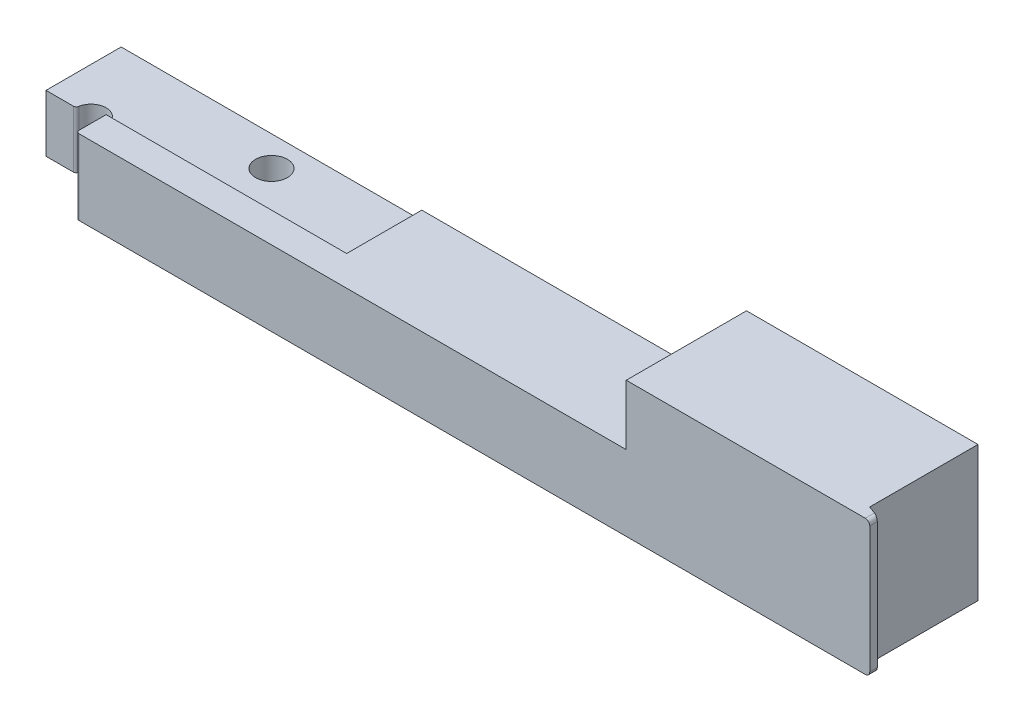
ISO-10303-21;
HEADER;
FILE_DESCRIPTION(('STEP AP214'),'2;1');
FILE_NAME('part.step','',(''),(''),'','','');
FILE_SCHEMA(('AUTOMOTIVE_DESIGN { 1 0 10303 214 1 1 1 1 }'));
ENDSEC;
DATA;
#1=APPLICATION_CONTEXT('core data for automotive mechanical design processes');
#2=APPLICATION_PROTOCOL_DEFINITION('international standard','automotive_design',2000,#1);
#3=PRODUCT_CONTEXT('',#1,'mechanical');
#4=PRODUCT('Part','Part','',(#3));
#5=PRODUCT_RELATED_PRODUCT_CATEGORY('part','',(#4));
#6=PRODUCT_DEFINITION_FORMATION('','',#4);
#7=PRODUCT_DEFINITION_CONTEXT('part definition',#1,'design');
#8=PRODUCT_DEFINITION('design','',#6,#7);
#9=PRODUCT_DEFINITION_SHAPE('','',#8);
#10=(LENGTH_UNIT() NAMED_UNIT(*) SI_UNIT(.MILLI.,.METRE.));
#11=(NAMED_UNIT(*) PLANE_ANGLE_UNIT() SI_UNIT($,.RADIAN.));
#12=(NAMED_UNIT(*) SI_UNIT($,.STERADIAN.) SOLID_ANGLE_UNIT());
#13=UNCERTAINTY_MEASURE_WITH_UNIT(LENGTH_MEASURE(1.E-05),#10,'distance_accuracy_value','');
#14=(GEOMETRIC_REPRESENTATION_CONTEXT(3) GLOBAL_UNCERTAINTY_ASSIGNED_CONTEXT((#13)) GLOBAL_UNIT_ASSIGNED_CONTEXT((#10,
#11,#12)) REPRESENTATION_CONTEXT('',''));
#15=CARTESIAN_POINT('',(0.,0.,0.));
#16=DIRECTION('',(0.,0.,1.));
#17=DIRECTION('',(1.,0.,0.));
#18=AXIS2_PLACEMENT_3D('',#15,#16,#17);
#19=CARTESIAN_POINT('',(0.,0.,-20.));
#20=DIRECTION('',(0.,-1.,0.));
#21=DIRECTION('',(1.,0.,0.));
#22=AXIS2_PLACEMENT_3D('',#19,#20,#21);
#23=PLANE('',#22);
#24=DIRECTION('',(0.,0.,-1.));
#25=VECTOR('',#24,1.);
#26=CARTESIAN_POINT('',(10.,0.,0.));
#27=LINE('',#26,#25);
#28=CARTESIAN_POINT('',(10.,0.,-0.5));
#29=VERTEX_POINT('',#28);
#30=CARTESIAN_POINT('',(10.,0.,-5.));
#31=VERTEX_POINT('',#30);
#32=EDGE_CURVE('E213',#29,#31,#27,.T.);
#33=ORIENTED_EDGE('',*,*,#32,.T.);
#34=DIRECTION('',(1.,0.,0.));
#35=VECTOR('',#34,1.);
#36=CARTESIAN_POINT('',(0.,0.,-5.));
#37=LINE('',#36,#35);
#38=CARTESIAN_POINT('',(50.,0.,-5.));
#39=VERTEX_POINT('',#38);
#40=EDGE_CURVE('E498',#31,#39,#37,.T.);
#41=ORIENTED_EDGE('',*,*,#40,.T.);
#42=DIRECTION('',(0.,0.,1.));
#43=VECTOR('',#42,1.);
#44=CARTESIAN_POINT('',(50.,0.,-17.5));
#45=LINE('',#44,#43);
#46=CARTESIAN_POINT('',(50.,0.,-17.5));
#47=VERTEX_POINT('',#46);
#48=EDGE_CURVE('E447',#47,#39,#45,.T.);
#49=ORIENTED_EDGE('',*,*,#48,.F.);
#50=DIRECTION('',(1.,0.,0.));
#51=VECTOR('',#50,1.);
#52=CARTESIAN_POINT('',(100.,0.,-17.5));
#53=LINE('',#52,#51);
#54=CARTESIAN_POINT('',(100.,0.,-17.5));
#55=VERTEX_POINT('',#54);
#56=EDGE_CURVE('E232',#47,#55,#53,.T.);
#57=ORIENTED_EDGE('',*,*,#56,.T.);
#58=DIRECTION('',(0.514495755427527,0.,-0.857492925712544));
#59=VECTOR('',#58,1.);
#60=CARTESIAN_POINT('',(100.,0.,-17.5));
#61=LINE('',#60,#59);
#62=CARTESIAN_POINT('',(101.5,0.,-20.));
#63=VERTEX_POINT('',#62);
#64=EDGE_CURVE('E236',#55,#63,#61,.T.);
#65=ORIENTED_EDGE('',*,*,#64,.T.);
#66=DIRECTION('',(1.,0.,0.));
#67=VECTOR('',#66,1.);
#68=CARTESIAN_POINT('',(0.,0.,-20.));
#69=LINE('',#68,#67);
#70=CARTESIAN_POINT('',(140.,0.,-20.));
#71=VERTEX_POINT('',#70);
#72=EDGE_CURVE('E257',#63,#71,#69,.T.);
#73=ORIENTED_EDGE('',*,*,#72,.T.);
#74=DIRECTION('',(0.,0.,1.));
#75=VECTOR('',#74,1.);
#76=CARTESIAN_POINT('',(140.,0.,-20.));
#77=LINE('',#76,#75);
#78=CARTESIAN_POINT('',(140.,0.,-1.97794046853239));
#79=VERTEX_POINT('',#78);
#80=EDGE_CURVE('E241',#71,#79,#77,.T.);
#81=ORIENTED_EDGE('',*,*,#80,.T.);
#82=DIRECTION('',(-0.939692620785909,0.,-0.342020143325667));
#83=VECTOR('',#82,1.);
#84=CARTESIAN_POINT('',(10.5847106977411,0.,-49.0812536335036));
#85=LINE('',#84,#83);
#86=CARTESIAN_POINT('',(141.25,0.,-1.52297767569964));
#87=VERTEX_POINT('',#86);
#88=EDGE_CURVE('E270',#79,#87,#85,.F.);
#89=ORIENTED_EDGE('',*,*,#88,.T.);
#90=DIRECTION('',(0.,0.,1.));
#91=VECTOR('',#90,1.);
#92=CARTESIAN_POINT('',(141.25,0.,-20.));
#93=LINE('',#92,#91);
#94=CARTESIAN_POINT('',(141.25,0.,0.));
#95=VERTEX_POINT('',#94);
#96=EDGE_CURVE('E276',#87,#95,#93,.T.);
#97=ORIENTED_EDGE('',*,*,#96,.T.);
#98=DIRECTION('',(1.,0.,0.));
#99=VECTOR('',#98,1.);
#100=CARTESIAN_POINT('',(0.,0.,0.));
#101=LINE('',#100,#99);
#102=CARTESIAN_POINT('',(10.5,0.,0.));
#103=VERTEX_POINT('',#102);
#104=EDGE_CURVE('E258',#103,#95,#101,.T.);
#105=ORIENTED_EDGE('',*,*,#104,.F.);
#106=CARTESIAN_POINT('',(10.5,0.,-0.5));
#107=DIRECTION('',(0.,-1.,0.));
#108=DIRECTION('',(1.,0.,0.));
#109=AXIS2_PLACEMENT_3D('',#106,#107,#108);
#110=CIRCLE('',#109,0.5);
#111=EDGE_CURVE('E309',#103,#29,#110,.T.);
#112=ORIENTED_EDGE('',*,*,#111,.T.);
#113=EDGE_LOOP('',(#33,#41,#49,#57,#65,#73,#81,#89,#97,#105,#112));
#114=FACE_BOUND('',#113,.T.);
#115=ADVANCED_FACE('F44',(#114),#23,.T.);
#116=CARTESIAN_POINT('',(100.,0.,-17.5));
#117=DIRECTION('',(0.,0.,1.));
#118=DIRECTION('',(1.,0.,0.));
#119=AXIS2_PLACEMENT_3D('',#116,#117,#118);
#120=PLANE('',#119);
#121=ORIENTED_EDGE('',*,*,#56,.F.);
#122=DIRECTION('',(0.,-1.,0.));
#123=VECTOR('',#122,1.);
#124=CARTESIAN_POINT('',(50.,1.50000000000001,-17.5));
#125=LINE('',#124,#123);
#126=CARTESIAN_POINT('',(50.,1.50000000000001,-17.5));
#127=VERTEX_POINT('',#126);
#128=EDGE_CURVE('E493',#127,#47,#125,.T.);
#129=ORIENTED_EDGE('',*,*,#128,.F.);
#130=DIRECTION('',(1.,0.,0.));
#131=VECTOR('',#130,1.);
#132=CARTESIAN_POINT('',(0.,1.5,-17.5));
#133=LINE('',#132,#131);
#134=CARTESIAN_POINT('',(0.,1.5,-17.5));
#135=VERTEX_POINT('',#134);
#136=EDGE_CURVE('E207',#135,#127,#133,.T.);
#137=ORIENTED_EDGE('',*,*,#136,.F.);
#138=DIRECTION('',(0.,1.,0.));
#139=VECTOR('',#138,1.);
#140=CARTESIAN_POINT('',(0.,0.,-17.5));
#141=LINE('',#140,#139);
#142=CARTESIAN_POINT('',(0.,11.,-17.5));
#143=VERTEX_POINT('',#142);
#144=EDGE_CURVE('E206',#135,#143,#141,.T.);
#145=ORIENTED_EDGE('',*,*,#144,.T.);
#146=DIRECTION('',(1.,0.,0.));
#147=VECTOR('',#146,1.);
#148=CARTESIAN_POINT('',(0.,11.,-17.5));
#149=LINE('',#148,#147);
#150=CARTESIAN_POINT('',(50.,11.,-17.5));
#151=VERTEX_POINT('',#150);
#152=EDGE_CURVE('E484',#143,#151,#149,.T.);
#153=ORIENTED_EDGE('',*,*,#152,.T.);
#154=DIRECTION('',(0.,1.,0.));
#155=VECTOR('',#154,1.);
#156=CARTESIAN_POINT('',(50.,11.,-17.5));
#157=LINE('',#156,#155);
#158=CARTESIAN_POINT('',(50.,12.5,-17.5));
#159=VERTEX_POINT('',#158);
#160=EDGE_CURVE('E452',#151,#159,#157,.T.);
#161=ORIENTED_EDGE('',*,*,#160,.T.);
#162=DIRECTION('',(1.,0.,0.));
#163=VECTOR('',#162,1.);
#164=CARTESIAN_POINT('',(100.,12.5,-17.5));
#165=LINE('',#164,#163);
#166=CARTESIAN_POINT('',(100.,12.5,-17.5));
#167=VERTEX_POINT('',#166);
#168=EDGE_CURVE('E219',#159,#167,#165,.T.);
#169=ORIENTED_EDGE('',*,*,#168,.T.);
#170=DIRECTION('',(0.,1.,0.));
#171=VECTOR('',#170,1.);
#172=CARTESIAN_POINT('',(100.,0.,-17.5));
#173=LINE('',#172,#171);
#174=EDGE_CURVE('E239',#55,#167,#173,.T.);
#175=ORIENTED_EDGE('',*,*,#174,.F.);
#176=EDGE_LOOP('',(#121,#129,#137,#145,#153,#161,#169,#175));
#177=FACE_BOUND('',#176,.T.);
#178=ADVANCED_FACE('F349',(#177),#120,.F.);
#179=CARTESIAN_POINT('',(0.,22.5,-20.));
#180=DIRECTION('',(0.,-1.,0.));
#181=DIRECTION('',(1.,0.,0.));
#182=AXIS2_PLACEMENT_3D('',#179,#180,#181);
#183=PLANE('',#182);
#184=DIRECTION('',(0.,0.,1.));
#185=VECTOR('',#184,1.);
#186=CARTESIAN_POINT('',(101.5,22.5,-20.));
#187=LINE('',#186,#185);
#188=CARTESIAN_POINT('',(101.5,22.5,-20.));
#189=VERTEX_POINT('',#188);
#190=CARTESIAN_POINT('',(101.5,22.5,0.));
#191=VERTEX_POINT('',#190);
#192=EDGE_CURVE('E467',#189,#191,#187,.T.);
#193=ORIENTED_EDGE('',*,*,#192,.T.);
#194=DIRECTION('',(1.,0.,0.));
#195=VECTOR('',#194,1.);
#196=CARTESIAN_POINT('',(0.,22.5,0.));
#197=LINE('',#196,#195);
#198=CARTESIAN_POINT('',(141.25,22.5,0.));
#199=VERTEX_POINT('',#198);
#200=EDGE_CURVE('E254',#191,#199,#197,.T.);
#201=ORIENTED_EDGE('',*,*,#200,.T.);
#202=DIRECTION('',(0.,0.,1.));
#203=VECTOR('',#202,1.);
#204=CARTESIAN_POINT('',(141.25,22.5,-1.24999999999999));
#205=LINE('',#204,#203);
#206=CARTESIAN_POINT('',(141.25,22.5,-1.52297767569964));
#207=VERTEX_POINT('',#206);
#208=EDGE_CURVE('E293',#199,#207,#205,.F.);
#209=ORIENTED_EDGE('',*,*,#208,.T.);
#210=DIRECTION('',(0.939692620785909,0.,0.342020143325667));
#211=VECTOR('',#210,1.);
#212=CARTESIAN_POINT('',(142.,22.5,-1.24999999999999));
#213=LINE('',#212,#211);
#214=CARTESIAN_POINT('',(140.,22.5,-1.97794046853239));
#215=VERTEX_POINT('',#214);
#216=EDGE_CURVE('E268',#207,#215,#213,.F.);
#217=ORIENTED_EDGE('',*,*,#216,.T.);
#218=DIRECTION('',(0.,0.,1.));
#219=VECTOR('',#218,1.);
#220=CARTESIAN_POINT('',(140.,22.5,-20.));
#221=LINE('',#220,#219);
#222=CARTESIAN_POINT('',(140.,22.5,-20.));
#223=VERTEX_POINT('',#222);
#224=EDGE_CURVE('E248',#223,#215,#221,.T.);
#225=ORIENTED_EDGE('',*,*,#224,.F.);
#226=DIRECTION('',(1.,0.,0.));
#227=VECTOR('',#226,1.);
#228=CARTESIAN_POINT('',(0.,22.5,-20.));
#229=LINE('',#228,#227);
#230=EDGE_CURVE('E255',#189,#223,#229,.T.);
#231=ORIENTED_EDGE('',*,*,#230,.F.);
#232=EDGE_LOOP('',(#193,#201,#209,#217,#225,#231));
#233=FACE_BOUND('',#232,.T.);
#234=ADVANCED_FACE('F356',(#233),#183,.F.);
#235=CARTESIAN_POINT('',(0.,0.,0.));
#236=DIRECTION('',(0.,0.,-1.));
#237=DIRECTION('',(-1.,0.,0.));
#238=AXIS2_PLACEMENT_3D('',#235,#236,#237);
#239=PLANE('',#238);
#240=DIRECTION('',(0.,1.,0.));
#241=VECTOR('',#240,1.);
#242=CARTESIAN_POINT('',(101.5,0.,0.));
#243=LINE('',#242,#241);
#244=CARTESIAN_POINT('',(101.5,12.5,0.));
#245=VERTEX_POINT('',#244);
#246=EDGE_CURVE('E214',#245,#191,#243,.T.);
#247=ORIENTED_EDGE('',*,*,#246,.F.);
#248=DIRECTION('',(-1.,0.,0.));
#249=VECTOR('',#248,1.);
#250=CARTESIAN_POINT('',(0.,12.5,0.));
#251=LINE('',#250,#249);
#252=CARTESIAN_POINT('',(10.5,12.5,0.));
#253=VERTEX_POINT('',#252);
#254=EDGE_CURVE('E459',#245,#253,#251,.T.);
#255=ORIENTED_EDGE('',*,*,#254,.T.);
#256=DIRECTION('',(0.,1.,0.));
#257=VECTOR('',#256,1.);
#258=CARTESIAN_POINT('',(10.5,0.,0.));
#259=LINE('',#258,#257);
#260=EDGE_CURVE('E314',#253,#103,#259,.F.);
#261=ORIENTED_EDGE('',*,*,#260,.T.);
#262=ORIENTED_EDGE('',*,*,#104,.T.);
#263=CARTESIAN_POINT('',(141.25,0.750000000000017,0.));
#264=DIRECTION('',(0.,0.,-1.));
#265=DIRECTION('',(-1.,0.,0.));
#266=AXIS2_PLACEMENT_3D('',#263,#264,#265);
#267=CIRCLE('',#266,0.75);
#268=CARTESIAN_POINT('',(142.,0.750000000000017,0.));
#269=VERTEX_POINT('',#268);
#270=EDGE_CURVE('E282',#95,#269,#267,.F.);
#271=ORIENTED_EDGE('',*,*,#270,.T.);
#272=DIRECTION('',(0.,1.,0.));
#273=VECTOR('',#272,1.);
#274=CARTESIAN_POINT('',(142.,0.,0.));
#275=LINE('',#274,#273);
#276=CARTESIAN_POINT('',(142.,21.75,0.));
#277=VERTEX_POINT('',#276);
#278=EDGE_CURVE('E262',#269,#277,#275,.T.);
#279=ORIENTED_EDGE('',*,*,#278,.T.);
#280=CARTESIAN_POINT('',(141.25,21.75,0.));
#281=DIRECTION('',(0.,0.,-1.));
#282=DIRECTION('',(-1.,0.,0.));
#283=AXIS2_PLACEMENT_3D('',#280,#281,#282);
#284=CIRCLE('',#283,0.75);
#285=EDGE_CURVE('E279',#277,#199,#284,.F.);
#286=ORIENTED_EDGE('',*,*,#285,.T.);
#287=ORIENTED_EDGE('',*,*,#200,.F.);
#288=EDGE_LOOP('',(#247,#255,#261,#262,#271,#279,#286,#287));
#289=FACE_BOUND('',#288,.T.);
#290=ADVANCED_FACE('F361',(#289),#239,.F.);
#291=CARTESIAN_POINT('',(142.,0.,-20.));
#292=DIRECTION('',(1.,0.,0.));
#293=DIRECTION('',(0.,0.,-1.));
#294=AXIS2_PLACEMENT_3D('',#291,#292,#293);
#295=PLANE('',#294);
#296=ORIENTED_EDGE('',*,*,#278,.F.);
#297=DIRECTION('',(0.,0.,1.));
#298=VECTOR('',#297,1.);
#299=CARTESIAN_POINT('',(142.,0.750000000000017,-20.));
#300=LINE('',#299,#298);
#301=CARTESIAN_POINT('',(142.,0.750000000000017,-1.24999999999999));
#302=VERTEX_POINT('',#301);
#303=EDGE_CURVE('E287',#269,#302,#300,.F.);
#304=ORIENTED_EDGE('',*,*,#303,.T.);
#305=DIRECTION('',(0.,1.,0.));
#306=VECTOR('',#305,1.);
#307=CARTESIAN_POINT('',(142.,0.,-1.24999999999999));
#308=LINE('',#307,#306);
#309=CARTESIAN_POINT('',(142.,21.75,-1.24999999999999));
#310=VERTEX_POINT('',#309);
#311=EDGE_CURVE('E260',#302,#310,#308,.T.);
#312=ORIENTED_EDGE('',*,*,#311,.T.);
#313=DIRECTION('',(0.,0.,1.));
#314=VECTOR('',#313,1.);
#315=CARTESIAN_POINT('',(142.,21.75,0.));
#316=LINE('',#315,#314);
#317=EDGE_CURVE('E284',#310,#277,#316,.T.);
#318=ORIENTED_EDGE('',*,*,#317,.T.);
#319=EDGE_LOOP('',(#296,#304,#312,#318));
#320=FACE_BOUND('',#319,.T.);
#321=ADVANCED_FACE('F363',(#320),#295,.T.);
#322=CARTESIAN_POINT('',(0.,0.,-20.));
#323=DIRECTION('',(1.,0.,0.));
#324=DIRECTION('',(0.,0.,-1.));
#325=AXIS2_PLACEMENT_3D('',#322,#323,#324);
#326=PLANE('',#325);
#327=ORIENTED_EDGE('',*,*,#144,.F.);
#328=DIRECTION('',(0.,0.,1.));
#329=VECTOR('',#328,1.);
#330=CARTESIAN_POINT('',(0.,1.5,-17.5));
#331=LINE('',#330,#329);
#332=CARTESIAN_POINT('',(0.,1.5,-5.));
#333=VERTEX_POINT('',#332);
#334=EDGE_CURVE('E193',#135,#333,#331,.T.);
#335=ORIENTED_EDGE('',*,*,#334,.T.);
#336=DIRECTION('',(0.,1.,0.));
#337=VECTOR('',#336,1.);
#338=CARTESIAN_POINT('',(0.,-0.00100000000003569,-5.));
#339=LINE('',#338,#337);
#340=CARTESIAN_POINT('',(0.,11.,-5.));
#341=VERTEX_POINT('',#340);
#342=EDGE_CURVE('E204',#333,#341,#339,.T.);
#343=ORIENTED_EDGE('',*,*,#342,.T.);
#344=DIRECTION('',(0.,0.,1.));
#345=VECTOR('',#344,1.);
#346=CARTESIAN_POINT('',(0.,11.,-17.5));
#347=LINE('',#346,#345);
#348=EDGE_CURVE('E477',#143,#341,#347,.T.);
#349=ORIENTED_EDGE('',*,*,#348,.F.);
#350=EDGE_LOOP('',(#327,#335,#343,#349));
#351=FACE_BOUND('',#350,.T.);
#352=ADVANCED_FACE('F202',(#351),#326,.F.);
#353=CARTESIAN_POINT('',(0.,0.,-20.));
#354=DIRECTION('',(0.,0.,-1.));
#355=DIRECTION('',(-1.,0.,0.));
#356=AXIS2_PLACEMENT_3D('',#353,#354,#355);
#357=PLANE('',#356);
#358=CARTESIAN_POINT('',(115.5,11.25,-20.));
#359=DIRECTION('',(0.,0.,-1.));
#360=DIRECTION('',(-1.,0.,0.));
#361=AXIS2_PLACEMENT_3D('',#358,#359,#360);
#362=CIRCLE('',#361,3.35);
#363=CARTESIAN_POINT('',(112.15,11.25,-20.));
#364=VERTEX_POINT('',#363);
#365=EDGE_CURVE('E225',#364,#364,#362,.T.);
#366=ORIENTED_EDGE('',*,*,#365,.F.);
#367=EDGE_LOOP('',(#366));
#368=FACE_BOUND('',#367,.T.);
#369=DIRECTION('',(0.,1.,0.));
#370=VECTOR('',#369,1.);
#371=CARTESIAN_POINT('',(101.5,0.,-20.));
#372=LINE('',#371,#370);
#373=CARTESIAN_POINT('',(101.5,12.5,-20.));
#374=VERTEX_POINT('',#373);
#375=EDGE_CURVE('E242',#63,#374,#372,.T.);
#376=ORIENTED_EDGE('',*,*,#375,.T.);
#377=DIRECTION('',(0.,-1.,0.));
#378=VECTOR('',#377,1.);
#379=CARTESIAN_POINT('',(101.5,22.5,-20.));
#380=LINE('',#379,#378);
#381=EDGE_CURVE('E433',#189,#374,#380,.T.);
#382=ORIENTED_EDGE('',*,*,#381,.F.);
#383=ORIENTED_EDGE('',*,*,#230,.T.);
#384=DIRECTION('',(0.,1.,0.));
#385=VECTOR('',#384,1.);
#386=CARTESIAN_POINT('',(140.,0.,-20.));
#387=LINE('',#386,#385);
#388=EDGE_CURVE('E251',#71,#223,#387,.T.);
#389=ORIENTED_EDGE('',*,*,#388,.F.);
#390=ORIENTED_EDGE('',*,*,#72,.F.);
#391=EDGE_LOOP('',(#376,#382,#383,#389,#390));
#392=FACE_BOUND('',#391,.T.);
#393=ADVANCED_FACE('F372',(#368,#392),#357,.T.);
#394=CARTESIAN_POINT('',(140.,0.,0.));
#395=DIRECTION('',(-1.,0.,0.));
#396=DIRECTION('',(0.,0.,1.));
#397=AXIS2_PLACEMENT_3D('',#394,#395,#396);
#398=PLANE('',#397);
#399=ORIENTED_EDGE('',*,*,#80,.F.);
#400=ORIENTED_EDGE('',*,*,#388,.T.);
#401=ORIENTED_EDGE('',*,*,#224,.T.);
#402=DIRECTION('',(0.,1.,0.));
#403=VECTOR('',#402,1.);
#404=CARTESIAN_POINT('',(140.,0.,-1.97794046853239));
#405=LINE('',#404,#403);
#406=EDGE_CURVE('E273',#215,#79,#405,.F.);
#407=ORIENTED_EDGE('',*,*,#406,.T.);
#408=EDGE_LOOP('',(#399,#400,#401,#407));
#409=FACE_BOUND('',#408,.T.);
#410=ADVANCED_FACE('F381',(#409),#398,.F.);
#411=CARTESIAN_POINT('',(142.,0.,-1.24999999999999));
#412=DIRECTION('',(-0.342020143325667,0.,0.939692620785909));
#413=DIRECTION('',(0.,1.,0.));
#414=AXIS2_PLACEMENT_3D('',#411,#412,#413);
#415=PLANE('',#414);
#416=ORIENTED_EDGE('',*,*,#311,.F.);
#417=CARTESIAN_POINT('',(141.25,0.750000000000017,-1.52297767569964));
#418=DIRECTION('',(-0.342020143325667,0.,0.939692620785909));
#419=DIRECTION('',(0.939692620785909,0.,0.342020143325667));
#420=AXIS2_PLACEMENT_3D('',#417,#418,#419);
#421=ELLIPSE('',#420,0.798133329356934,0.75);
#422=EDGE_CURVE('E291',#302,#87,#421,.F.);
#423=ORIENTED_EDGE('',*,*,#422,.T.);
#424=ORIENTED_EDGE('',*,*,#88,.F.);
#425=ORIENTED_EDGE('',*,*,#406,.F.);
#426=ORIENTED_EDGE('',*,*,#216,.F.);
#427=CARTESIAN_POINT('',(141.25,21.75,-1.52297767569964));
#428=DIRECTION('',(-0.342020143325667,0.,0.939692620785909));
#429=DIRECTION('',(-0.939692620785909,0.,-0.342020143325667));
#430=AXIS2_PLACEMENT_3D('',#427,#428,#429);
#431=ELLIPSE('',#430,0.798133329356934,0.75);
#432=EDGE_CURVE('E289',#207,#310,#431,.F.);
#433=ORIENTED_EDGE('',*,*,#432,.T.);
#434=EDGE_LOOP('',(#416,#423,#424,#425,#426,#433));
#435=FACE_BOUND('',#434,.T.);
#436=ADVANCED_FACE('F374',(#435),#415,.F.);
#437=CARTESIAN_POINT('',(141.25,0.750000000000017,-20.));
#438=DIRECTION('',(0.,0.,1.));
#439=DIRECTION('',(1.,0.,0.));
#440=AXIS2_PLACEMENT_3D('',#437,#438,#439);
#441=CYLINDRICAL_SURFACE('',#440,0.75);
#442=ORIENTED_EDGE('',*,*,#422,.F.);
#443=ORIENTED_EDGE('',*,*,#303,.F.);
#444=ORIENTED_EDGE('',*,*,#270,.F.);
#445=ORIENTED_EDGE('',*,*,#96,.F.);
#446=EDGE_LOOP('',(#442,#443,#444,#445));
#447=FACE_BOUND('',#446,.T.);
#448=ADVANCED_FACE('F380',(#447),#441,.T.);
#449=CARTESIAN_POINT('',(141.25,21.75,-20.));
#450=DIRECTION('',(0.,0.,-1.));
#451=DIRECTION('',(-1.,0.,0.));
#452=AXIS2_PLACEMENT_3D('',#449,#450,#451);
#453=CYLINDRICAL_SURFACE('',#452,0.75);
#454=ORIENTED_EDGE('',*,*,#432,.F.);
#455=ORIENTED_EDGE('',*,*,#208,.F.);
#456=ORIENTED_EDGE('',*,*,#285,.F.);
#457=ORIENTED_EDGE('',*,*,#317,.F.);
#458=EDGE_LOOP('',(#454,#455,#456,#457));
#459=FACE_BOUND('',#458,.T.);
#460=ADVANCED_FACE('F385',(#459),#453,.T.);
#461=CARTESIAN_POINT('',(100.,0.,-17.5));
#462=DIRECTION('',(0.857492925712544,0.,0.514495755427527));
#463=DIRECTION('',(0.514495755427527,0.,-0.857492925712544));
#464=AXIS2_PLACEMENT_3D('',#461,#462,#463);
#465=PLANE('',#464);
#466=ORIENTED_EDGE('',*,*,#174,.T.);
#467=DIRECTION('',(0.514495755427527,0.,-0.857492925712544));
#468=VECTOR('',#467,1.);
#469=CARTESIAN_POINT('',(100.,12.5,-17.5));
#470=LINE('',#469,#468);
#471=EDGE_CURVE('E440',#167,#374,#470,.T.);
#472=ORIENTED_EDGE('',*,*,#471,.T.);
#473=ORIENTED_EDGE('',*,*,#375,.F.);
#474=ORIENTED_EDGE('',*,*,#64,.F.);
#475=EDGE_LOOP('',(#466,#472,#473,#474));
#476=FACE_BOUND('',#475,.T.);
#477=ADVANCED_FACE('F389',(#476),#465,.F.);
#478=CARTESIAN_POINT('',(30.,-0.00100000000003223,-12.5));
#479=DIRECTION('',(0.,1.,0.));
#480=DIRECTION('',(-1.,0.,0.));
#481=AXIS2_PLACEMENT_3D('',#478,#479,#480);
#482=CYLINDRICAL_SURFACE('',#481,2.65);
#483=CARTESIAN_POINT('',(30.,1.5,-12.5));
#484=DIRECTION('',(0.,1.,0.));
#485=DIRECTION('',(-1.,0.,0.));
#486=AXIS2_PLACEMENT_3D('',#483,#484,#485);
#487=CIRCLE('',#486,2.65);
#488=CARTESIAN_POINT('',(27.35,1.5,-12.5));
#489=VERTEX_POINT('',#488);
#490=EDGE_CURVE('E482',#489,#489,#487,.F.);
#491=ORIENTED_EDGE('',*,*,#490,.T.);
#492=EDGE_LOOP('',(#491));
#493=FACE_BOUND('',#492,.T.);
#494=CARTESIAN_POINT('',(30.,11.,-12.5));
#495=DIRECTION('',(0.,-1.,0.));
#496=DIRECTION('',(0.,0.,-1.));
#497=AXIS2_PLACEMENT_3D('',#494,#495,#496);
#498=CIRCLE('',#497,2.65);
#499=CARTESIAN_POINT('',(30.,11.,-15.15));
#500=VERTEX_POINT('',#499);
#501=EDGE_CURVE('E333',#500,#500,#498,.F.);
#502=ORIENTED_EDGE('',*,*,#501,.T.);
#503=EDGE_LOOP('',(#502));
#504=FACE_BOUND('',#503,.T.);
#505=ADVANCED_FACE('F538',(#493,#504),#482,.F.);
#506=CARTESIAN_POINT('',(115.5,11.25,-15.));
#507=DIRECTION('',(0.,0.,-1.));
#508=DIRECTION('',(-1.,0.,0.));
#509=AXIS2_PLACEMENT_3D('',#506,#507,#508);
#510=CYLINDRICAL_SURFACE('',#509,2.95);
#511=CARTESIAN_POINT('',(115.5,11.25,-17.0000000000012));
#512=DIRECTION('',(0.,0.,-1.));
#513=DIRECTION('',(-1.,0.,0.));
#514=AXIS2_PLACEMENT_3D('',#511,#512,#513);
#515=CIRCLE('',#514,2.95);
#516=CARTESIAN_POINT('',(112.55,11.25,-17.0000000000012));
#517=VERTEX_POINT('',#516);
#518=EDGE_CURVE('E295',#517,#517,#515,.F.);
#519=ORIENTED_EDGE('',*,*,#518,.T.);
#520=EDGE_LOOP('',(#519));
#521=FACE_BOUND('',#520,.T.);
#522=CARTESIAN_POINT('',(115.5,11.25,-15.));
#523=DIRECTION('',(0.,0.,-1.));
#524=DIRECTION('',(-1.,0.,0.));
#525=AXIS2_PLACEMENT_3D('',#522,#523,#524);
#526=CIRCLE('',#525,2.95);
#527=CARTESIAN_POINT('',(112.55,11.25,-15.));
#528=VERTEX_POINT('',#527);
#529=EDGE_CURVE('E226',#528,#528,#526,.T.);
#530=ORIENTED_EDGE('',*,*,#529,.T.);
#531=EDGE_LOOP('',(#530));
#532=FACE_BOUND('',#531,.T.);
#533=ADVANCED_FACE('F534',(#521,#532),#510,.T.);
#534=CARTESIAN_POINT('',(115.5,11.25,-15.));
#535=DIRECTION('',(0.,0.,-1.));
#536=DIRECTION('',(-1.,0.,0.));
#537=AXIS2_PLACEMENT_3D('',#534,#535,#536);
#538=CYLINDRICAL_SURFACE('',#537,3.35);
#539=CARTESIAN_POINT('',(115.5,11.25,-15.));
#540=DIRECTION('',(0.,0.,-1.));
#541=DIRECTION('',(-1.,0.,0.));
#542=AXIS2_PLACEMENT_3D('',#539,#540,#541);
#543=CIRCLE('',#542,3.35);
#544=CARTESIAN_POINT('',(112.15,11.25,-15.));
#545=VERTEX_POINT('',#544);
#546=EDGE_CURVE('E229',#545,#545,#543,.T.);
#547=ORIENTED_EDGE('',*,*,#546,.F.);
#548=EDGE_LOOP('',(#547));
#549=FACE_BOUND('',#548,.T.);
#550=ORIENTED_EDGE('',*,*,#365,.T.);
#551=EDGE_LOOP('',(#550));
#552=FACE_BOUND('',#551,.T.);
#553=ADVANCED_FACE('F417',(#549,#552),#538,.F.);
#554=CARTESIAN_POINT('',(0.,0.,-15.));
#555=DIRECTION('',(0.,0.,-1.));
#556=DIRECTION('',(-1.,0.,0.));
#557=AXIS2_PLACEMENT_3D('',#554,#555,#556);
#558=PLANE('',#557);
#559=ORIENTED_EDGE('',*,*,#529,.F.);
#560=EDGE_LOOP('',(#559));
#561=FACE_BOUND('',#560,.T.);
#562=ORIENTED_EDGE('',*,*,#546,.T.);
#563=EDGE_LOOP('',(#562));
#564=FACE_BOUND('',#563,.T.);
#565=ADVANCED_FACE('F411',(#561,#564),#558,.T.);
#566=CARTESIAN_POINT('',(115.5,11.25,-20.));
#567=DIRECTION('',(0.,0.,-1.));
#568=DIRECTION('',(-1.,0.,0.));
#569=AXIS2_PLACEMENT_3D('',#566,#567,#568);
#570=CIRCLE('',#569,1.77120283540492);
#571=CARTESIAN_POINT('',(113.728797164595,11.25,-20.));
#572=VERTEX_POINT('',#571);
#573=EDGE_CURVE('E298',#572,#572,#570,.T.);
#574=ORIENTED_EDGE('',*,*,#573,.T.);
#575=EDGE_LOOP('',(#574));
#576=FACE_BOUND('',#575,.T.);
#577=ADVANCED_FACE('F396',(#576),#357,.T.);
#578=CARTESIAN_POINT('',(115.5,11.25,-20.));
#579=DIRECTION('',(0.,0.,1.));
#580=DIRECTION('',(1.,0.,0.));
#581=AXIS2_PLACEMENT_3D('',#578,#579,#580);
#582=CONICAL_SURFACE('',#581,2.68753400942234,0.0872664625997127);
#583=CARTESIAN_POINT('',(115.5,11.25,-19.0871557427477));
#584=DIRECTION('',(0.,0.,-1.));
#585=DIRECTION('',(-1.,0.,0.));
#586=AXIS2_PLACEMENT_3D('',#583,#584,#585);
#587=CIRCLE('',#586,2.76739753349666);
#588=CARTESIAN_POINT('',(112.732602466503,11.25,-19.0871557427477));
#589=VERTEX_POINT('',#588);
#590=EDGE_CURVE('E301',#589,#589,#587,.F.);
#591=ORIENTED_EDGE('',*,*,#590,.T.);
#592=EDGE_LOOP('',(#591));
#593=FACE_BOUND('',#592,.T.);
#594=ORIENTED_EDGE('',*,*,#518,.F.);
#595=EDGE_LOOP('',(#594));
#596=FACE_BOUND('',#595,.T.);
#597=ADVANCED_FACE('F391',(#593,#596),#582,.T.);
#598=CARTESIAN_POINT('',(115.5,11.25,-19.));
#599=DIRECTION('',(0.,0.,-1.));
#600=DIRECTION('',(-1.,0.,0.));
#601=AXIS2_PLACEMENT_3D('',#598,#599,#600);
#602=TOROIDAL_SURFACE('',#601,1.77120283540492,1.);
#603=ORIENTED_EDGE('',*,*,#590,.F.);
#604=EDGE_LOOP('',(#603));
#605=FACE_BOUND('',#604,.T.);
#606=ORIENTED_EDGE('',*,*,#573,.F.);
#607=EDGE_LOOP('',(#606));
#608=FACE_BOUND('',#607,.T.);
#609=ADVANCED_FACE('F395',(#605,#608),#602,.T.);
#610=CARTESIAN_POINT('',(7.5,-0.00100000000003569,-5.));
#611=DIRECTION('',(0.,1.,0.));
#612=DIRECTION('',(-1.,0.,0.));
#613=AXIS2_PLACEMENT_3D('',#610,#611,#612);
#614=CYLINDRICAL_SURFACE('',#613,2.5);
#615=DIRECTION('',(0.,1.,0.));
#616=VECTOR('',#615,1.);
#617=CARTESIAN_POINT('',(5.03496675704183,-0.001000000000036,-5.41666666666667));
#618=LINE('',#617,#616);
#619=CARTESIAN_POINT('',(5.03496675704183,11.,-5.41666666666667));
#620=VERTEX_POINT('',#619);
#621=CARTESIAN_POINT('',(5.03496675704183,1.5,-5.41666666666667));
#622=VERTEX_POINT('',#621);
#623=EDGE_CURVE('E306',#620,#622,#618,.F.);
#624=ORIENTED_EDGE('',*,*,#623,.T.);
#625=CARTESIAN_POINT('',(7.5,1.5,-5.));
#626=DIRECTION('',(0.,1.,0.));
#627=DIRECTION('',(-1.,0.,0.));
#628=AXIS2_PLACEMENT_3D('',#625,#626,#627);
#629=CIRCLE('',#628,2.5);
#630=CARTESIAN_POINT('',(10.,1.5,-5.));
#631=VERTEX_POINT('',#630);
#632=EDGE_CURVE('E58',#622,#631,#629,.F.);
#633=ORIENTED_EDGE('',*,*,#632,.T.);
#634=DIRECTION('',(0.,1.,0.));
#635=VECTOR('',#634,1.);
#636=CARTESIAN_POINT('',(10.,-0.00100000000003569,-5.));
#637=LINE('',#636,#635);
#638=CARTESIAN_POINT('',(10.,11.,-5.));
#639=VERTEX_POINT('',#638);
#640=EDGE_CURVE('E217',#631,#639,#637,.T.);
#641=ORIENTED_EDGE('',*,*,#640,.T.);
#642=CARTESIAN_POINT('',(7.5,11.,-5.));
#643=DIRECTION('',(0.,-1.,0.));
#644=DIRECTION('',(0.,0.,-1.));
#645=AXIS2_PLACEMENT_3D('',#642,#643,#644);
#646=CIRCLE('',#645,2.5);
#647=EDGE_CURVE('E326',#639,#620,#646,.F.);
#648=ORIENTED_EDGE('',*,*,#647,.T.);
#649=EDGE_LOOP('',(#624,#633,#641,#648));
#650=FACE_BOUND('',#649,.T.);
#651=ADVANCED_FACE('F331',(#650),#614,.F.);
#652=CARTESIAN_POINT('',(10.,-0.00100000000003569,0.));
#653=DIRECTION('',(1.,0.,0.));
#654=DIRECTION('',(0.,0.,-1.));
#655=AXIS2_PLACEMENT_3D('',#652,#653,#654);
#656=PLANE('',#655);
#657=DIRECTION('',(0.,1.,0.));
#658=VECTOR('',#657,1.);
#659=CARTESIAN_POINT('',(10.,-0.00100000000003569,-0.5));
#660=LINE('',#659,#658);
#661=CARTESIAN_POINT('',(10.,12.5,-0.5));
#662=VERTEX_POINT('',#661);
#663=EDGE_CURVE('E311',#29,#662,#660,.T.);
#664=ORIENTED_EDGE('',*,*,#663,.T.);
#665=DIRECTION('',(0.,0.,-1.));
#666=VECTOR('',#665,1.);
#667=CARTESIAN_POINT('',(10.,12.5,0.));
#668=LINE('',#667,#666);
#669=CARTESIAN_POINT('',(10.,12.5,-5.));
#670=VERTEX_POINT('',#669);
#671=EDGE_CURVE('E462',#662,#670,#668,.T.);
#672=ORIENTED_EDGE('',*,*,#671,.T.);
#673=DIRECTION('',(0.,-1.,0.));
#674=VECTOR('',#673,1.);
#675=CARTESIAN_POINT('',(10.,-0.00100000000003569,-5.));
#676=LINE('',#675,#674);
#677=EDGE_CURVE('E334',#670,#639,#676,.T.);
#678=ORIENTED_EDGE('',*,*,#677,.T.);
#679=ORIENTED_EDGE('',*,*,#640,.F.);
#680=EDGE_CURVE('E223',#31,#631,#637,.T.);
#681=ORIENTED_EDGE('',*,*,#680,.F.);
#682=ORIENTED_EDGE('',*,*,#32,.F.);
#683=EDGE_LOOP('',(#664,#672,#678,#679,#681,#682));
#684=FACE_BOUND('',#683,.T.);
#685=ADVANCED_FACE('F345',(#684),#656,.F.);
#686=CARTESIAN_POINT('',(0.,-0.00100000000003569,-5.));
#687=DIRECTION('',(0.,0.,-1.));
#688=DIRECTION('',(-1.,0.,0.));
#689=AXIS2_PLACEMENT_3D('',#686,#687,#688);
#690=PLANE('',#689);
#691=ORIENTED_EDGE('',*,*,#342,.F.);
#692=DIRECTION('',(1.,0.,0.));
#693=VECTOR('',#692,1.);
#694=CARTESIAN_POINT('',(0.,1.5,-5.));
#695=LINE('',#694,#693);
#696=CARTESIAN_POINT('',(4.54196010845019,1.5,-5.));
#697=VERTEX_POINT('',#696);
#698=EDGE_CURVE('E189',#333,#697,#695,.T.);
#699=ORIENTED_EDGE('',*,*,#698,.T.);
#700=DIRECTION('',(0.,1.,0.));
#701=VECTOR('',#700,1.);
#702=CARTESIAN_POINT('',(4.54196010845019,-0.00100000000003514,-5.));
#703=LINE('',#702,#701);
#704=CARTESIAN_POINT('',(4.54196010845019,11.,-5.));
#705=VERTEX_POINT('',#704);
#706=EDGE_CURVE('E304',#697,#705,#703,.T.);
#707=ORIENTED_EDGE('',*,*,#706,.T.);
#708=DIRECTION('',(1.,0.,0.));
#709=VECTOR('',#708,1.);
#710=CARTESIAN_POINT('',(0.,11.,-5.));
#711=LINE('',#710,#709);
#712=EDGE_CURVE('E212',#341,#705,#711,.T.);
#713=ORIENTED_EDGE('',*,*,#712,.F.);
#714=EDGE_LOOP('',(#691,#699,#707,#713));
#715=FACE_BOUND('',#714,.T.);
#716=ADVANCED_FACE('F210',(#715),#690,.F.);
#717=CARTESIAN_POINT('',(4.54196010845019,-0.00100000000003606,-5.5));
#718=DIRECTION('',(0.,1.,0.));
#719=DIRECTION('',(-1.,0.,0.));
#720=AXIS2_PLACEMENT_3D('',#717,#718,#719);
#721=CYLINDRICAL_SURFACE('',#720,0.5);
#722=CARTESIAN_POINT('',(4.54196010845019,1.5,-5.5));
#723=DIRECTION('',(0.,1.,0.));
#724=DIRECTION('',(-1.,0.,0.));
#725=AXIS2_PLACEMENT_3D('',#722,#723,#724);
#726=CIRCLE('',#725,0.5);
#727=EDGE_CURVE('E11',#622,#697,#726,.F.);
#728=ORIENTED_EDGE('',*,*,#727,.F.);
#729=ORIENTED_EDGE('',*,*,#623,.F.);
#730=CARTESIAN_POINT('',(4.54196010845019,11.,-5.5));
#731=DIRECTION('',(0.,-1.,0.));
#732=DIRECTION('',(0.,0.,-1.));
#733=AXIS2_PLACEMENT_3D('',#730,#731,#732);
#734=CIRCLE('',#733,0.5);
#735=EDGE_CURVE('E52',#705,#620,#734,.F.);
#736=ORIENTED_EDGE('',*,*,#735,.F.);
#737=ORIENTED_EDGE('',*,*,#706,.F.);
#738=EDGE_LOOP('',(#728,#729,#736,#737));
#739=FACE_BOUND('',#738,.T.);
#740=ADVANCED_FACE('F336',(#739),#721,.T.);
#741=CARTESIAN_POINT('',(10.5,-0.00100000000003563,-0.5));
#742=DIRECTION('',(0.,1.,0.));
#743=DIRECTION('',(-1.,0.,0.));
#744=AXIS2_PLACEMENT_3D('',#741,#742,#743);
#745=CYLINDRICAL_SURFACE('',#744,0.5);
#746=CARTESIAN_POINT('',(10.5,12.5,-0.5));
#747=DIRECTION('',(0.,-1.,0.));
#748=DIRECTION('',(0.,0.,-1.));
#749=AXIS2_PLACEMENT_3D('',#746,#747,#748);
#750=CIRCLE('',#749,0.5);
#751=EDGE_CURVE('E316',#662,#253,#750,.F.);
#752=ORIENTED_EDGE('',*,*,#751,.F.);
#753=ORIENTED_EDGE('',*,*,#663,.F.);
#754=ORIENTED_EDGE('',*,*,#111,.F.);
#755=ORIENTED_EDGE('',*,*,#260,.F.);
#756=EDGE_LOOP('',(#752,#753,#754,#755));
#757=FACE_BOUND('',#756,.T.);
#758=ADVANCED_FACE('F46',(#757),#745,.T.);
#759=CARTESIAN_POINT('',(101.5,22.5,-20.));
#760=DIRECTION('',(-1.,0.,0.));
#761=DIRECTION('',(0.,0.,1.));
#762=AXIS2_PLACEMENT_3D('',#759,#760,#761);
#763=PLANE('',#762);
#764=ORIENTED_EDGE('',*,*,#246,.T.);
#765=ORIENTED_EDGE('',*,*,#192,.F.);
#766=ORIENTED_EDGE('',*,*,#381,.T.);
#767=DIRECTION('',(0.,0.,1.));
#768=VECTOR('',#767,1.);
#769=CARTESIAN_POINT('',(101.5,12.5,-20.));
#770=LINE('',#769,#768);
#771=EDGE_CURVE('E458',#374,#245,#770,.T.);
#772=ORIENTED_EDGE('',*,*,#771,.T.);
#773=EDGE_LOOP('',(#764,#765,#766,#772));
#774=FACE_BOUND('',#773,.T.);
#775=ADVANCED_FACE('F343',(#774),#763,.T.);
#776=CARTESIAN_POINT('',(0.,12.5,-20.));
#777=DIRECTION('',(0.,-1.,0.));
#778=DIRECTION('',(0.,0.,-1.));
#779=AXIS2_PLACEMENT_3D('',#776,#777,#778);
#780=PLANE('',#779);
#781=DIRECTION('',(0.,0.,1.));
#782=VECTOR('',#781,1.);
#783=CARTESIAN_POINT('',(50.,12.5,-17.5));
#784=LINE('',#783,#782);
#785=CARTESIAN_POINT('',(50.,12.5,-5.));
#786=VERTEX_POINT('',#785);
#787=EDGE_CURVE('E479',#159,#786,#784,.T.);
#788=ORIENTED_EDGE('',*,*,#787,.T.);
#789=DIRECTION('',(-1.,0.,0.));
#790=VECTOR('',#789,1.);
#791=CARTESIAN_POINT('',(0.,12.5,-5.));
#792=LINE('',#791,#790);
#793=EDGE_CURVE('E318',#786,#670,#792,.T.);
#794=ORIENTED_EDGE('',*,*,#793,.T.);
#795=ORIENTED_EDGE('',*,*,#671,.F.);
#796=ORIENTED_EDGE('',*,*,#751,.T.);
#797=ORIENTED_EDGE('',*,*,#254,.F.);
#798=ORIENTED_EDGE('',*,*,#771,.F.);
#799=ORIENTED_EDGE('',*,*,#471,.F.);
#800=ORIENTED_EDGE('',*,*,#168,.F.);
#801=EDGE_LOOP('',(#788,#794,#795,#796,#797,#798,#799,#800));
#802=FACE_BOUND('',#801,.T.);
#803=ADVANCED_FACE('F456',(#802),#780,.F.);
#804=CARTESIAN_POINT('',(0.,11.,0.));
#805=DIRECTION('',(0.,-1.,0.));
#806=DIRECTION('',(0.,0.,-1.));
#807=AXIS2_PLACEMENT_3D('',#804,#805,#806);
#808=PLANE('',#807);
#809=CARTESIAN_POINT('',(50.,11.,-5.));
#810=VERTEX_POINT('',#809);
#811=EDGE_CURVE('E481',#639,#810,#711,.T.);
#812=ORIENTED_EDGE('',*,*,#811,.T.);
#813=DIRECTION('',(0.,0.,1.));
#814=VECTOR('',#813,1.);
#815=CARTESIAN_POINT('',(50.,11.,-17.5));
#816=LINE('',#815,#814);
#817=EDGE_CURVE('E486',#151,#810,#816,.T.);
#818=ORIENTED_EDGE('',*,*,#817,.F.);
#819=ORIENTED_EDGE('',*,*,#152,.F.);
#820=ORIENTED_EDGE('',*,*,#348,.T.);
#821=ORIENTED_EDGE('',*,*,#712,.T.);
#822=ORIENTED_EDGE('',*,*,#735,.T.);
#823=ORIENTED_EDGE('',*,*,#647,.F.);
#824=EDGE_LOOP('',(#812,#818,#819,#820,#821,#822,#823));
#825=FACE_BOUND('',#824,.T.);
#826=ORIENTED_EDGE('',*,*,#501,.F.);
#827=EDGE_LOOP('',(#826));
#828=FACE_BOUND('',#827,.T.);
#829=ADVANCED_FACE('F324',(#825,#828),#808,.F.);
#830=CARTESIAN_POINT('',(0.,11.,-5.));
#831=DIRECTION('',(0.,0.,1.));
#832=DIRECTION('',(1.,0.,0.));
#833=AXIS2_PLACEMENT_3D('',#830,#831,#832);
#834=PLANE('',#833);
#835=ORIENTED_EDGE('',*,*,#793,.F.);
#836=DIRECTION('',(0.,1.,0.));
#837=VECTOR('',#836,1.);
#838=CARTESIAN_POINT('',(50.,11.,-5.));
#839=LINE('',#838,#837);
#840=EDGE_CURVE('E66',#810,#786,#839,.T.);
#841=ORIENTED_EDGE('',*,*,#840,.F.);
#842=ORIENTED_EDGE('',*,*,#811,.F.);
#843=ORIENTED_EDGE('',*,*,#677,.F.);
#844=EDGE_LOOP('',(#835,#841,#842,#843));
#845=FACE_BOUND('',#844,.T.);
#846=ADVANCED_FACE('F512',(#845),#834,.F.);
#847=CARTESIAN_POINT('',(50.,11.,-17.5));
#848=DIRECTION('',(-1.,0.,0.));
#849=DIRECTION('',(0.,0.,1.));
#850=AXIS2_PLACEMENT_3D('',#847,#848,#849);
#851=PLANE('',#850);
#852=ORIENTED_EDGE('',*,*,#787,.F.);
#853=ORIENTED_EDGE('',*,*,#160,.F.);
#854=ORIENTED_EDGE('',*,*,#817,.T.);
#855=ORIENTED_EDGE('',*,*,#840,.T.);
#856=EDGE_LOOP('',(#852,#853,#854,#855));
#857=FACE_BOUND('',#856,.T.);
#858=ADVANCED_FACE('F514',(#857),#851,.T.);
#859=CARTESIAN_POINT('',(0.,1.5,-5.));
#860=DIRECTION('',(0.,0.,-1.));
#861=DIRECTION('',(-1.,0.,0.));
#862=AXIS2_PLACEMENT_3D('',#859,#860,#861);
#863=PLANE('',#862);
#864=ORIENTED_EDGE('',*,*,#680,.T.);
#865=CARTESIAN_POINT('',(50.,1.50000000000001,-5.));
#866=VERTEX_POINT('',#865);
#867=EDGE_CURVE('E198',#631,#866,#695,.T.);
#868=ORIENTED_EDGE('',*,*,#867,.T.);
#869=DIRECTION('',(0.,-1.,0.));
#870=VECTOR('',#869,1.);
#871=CARTESIAN_POINT('',(50.,1.50000000000001,-5.));
#872=LINE('',#871,#870);
#873=EDGE_CURVE('E492',#866,#39,#872,.T.);
#874=ORIENTED_EDGE('',*,*,#873,.T.);
#875=ORIENTED_EDGE('',*,*,#40,.F.);
#876=EDGE_LOOP('',(#864,#868,#874,#875));
#877=FACE_BOUND('',#876,.T.);
#878=ADVANCED_FACE('F507',(#877),#863,.T.);
#879=CARTESIAN_POINT('',(0.,1.5,0.));
#880=DIRECTION('',(0.,1.,0.));
#881=DIRECTION('',(0.,0.,-1.));
#882=AXIS2_PLACEMENT_3D('',#879,#880,#881);
#883=PLANE('',#882);
#884=ORIENTED_EDGE('',*,*,#727,.T.);
#885=ORIENTED_EDGE('',*,*,#698,.F.);
#886=ORIENTED_EDGE('',*,*,#334,.F.);
#887=ORIENTED_EDGE('',*,*,#136,.T.);
#888=DIRECTION('',(0.,0.,1.));
#889=VECTOR('',#888,1.);
#890=CARTESIAN_POINT('',(50.,1.50000000000001,-17.5));
#891=LINE('',#890,#889);
#892=EDGE_CURVE('E495',#127,#866,#891,.T.);
#893=ORIENTED_EDGE('',*,*,#892,.T.);
#894=ORIENTED_EDGE('',*,*,#867,.F.);
#895=ORIENTED_EDGE('',*,*,#632,.F.);
#896=EDGE_LOOP('',(#884,#885,#886,#887,#893,#894,#895));
#897=FACE_BOUND('',#896,.T.);
#898=ORIENTED_EDGE('',*,*,#490,.F.);
#899=EDGE_LOOP('',(#898));
#900=FACE_BOUND('',#899,.T.);
#901=ADVANCED_FACE('F191',(#897,#900),#883,.F.);
#902=CARTESIAN_POINT('',(50.,1.50000000000001,-17.5));
#903=DIRECTION('',(1.,0.,0.));
#904=DIRECTION('',(0.,1.,0.));
#905=AXIS2_PLACEMENT_3D('',#902,#903,#904);
#906=PLANE('',#905);
#907=ORIENTED_EDGE('',*,*,#48,.T.);
#908=ORIENTED_EDGE('',*,*,#873,.F.);
#909=ORIENTED_EDGE('',*,*,#892,.F.);
#910=ORIENTED_EDGE('',*,*,#128,.T.);
#911=EDGE_LOOP('',(#907,#908,#909,#910));
#912=FACE_BOUND('',#911,.T.);
#913=ADVANCED_FACE('F505',(#912),#906,.F.);
#914=CLOSED_SHELL('',(#115,#178,#234,#290,#321,#352,#393,#410,#436,#448,#460,#477,#505,#533,
#553,#565,#577,#597,#609,#651,#685,#716,#740,#758,#775,#803,#829,#846,#858,#878,#901,#913));
#915=MANIFOLD_SOLID_BREP('B2',#914);
#916=ADVANCED_BREP_SHAPE_REPRESENTATION('',(#18,#915),#14);
#917=SHAPE_DEFINITION_REPRESENTATION(#9,#916);
ENDSEC;
END-ISO-10303-21;
